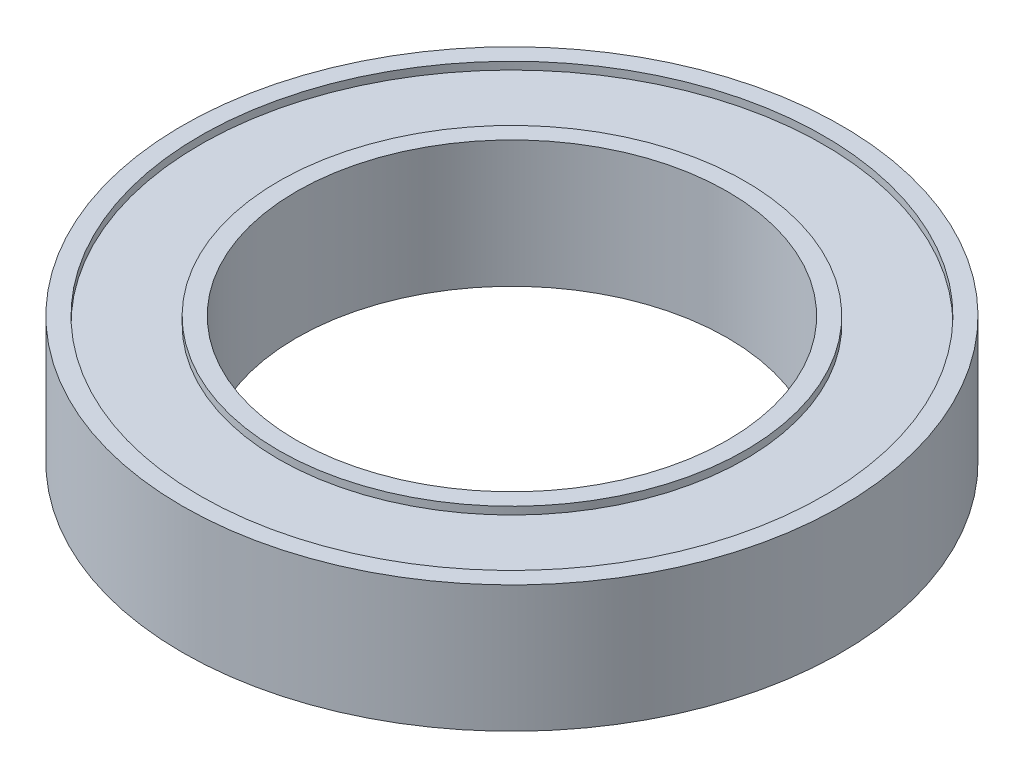
ISO-10303-21;
HEADER;
FILE_DESCRIPTION(('STEP AP214'),'2;1');
FILE_NAME('part.step','',(''),(''),'','','');
FILE_SCHEMA(('AUTOMOTIVE_DESIGN { 1 0 10303 214 1 1 1 1 }'));
ENDSEC;
DATA;
#1=APPLICATION_CONTEXT('core data for automotive mechanical design processes');
#2=APPLICATION_PROTOCOL_DEFINITION('international standard','automotive_design',2000,#1);
#3=PRODUCT_CONTEXT('',#1,'mechanical');
#4=PRODUCT('Part','Part','',(#3));
#5=PRODUCT_RELATED_PRODUCT_CATEGORY('part','',(#4));
#6=PRODUCT_DEFINITION_FORMATION('','',#4);
#7=PRODUCT_DEFINITION_CONTEXT('part definition',#1,'design');
#8=PRODUCT_DEFINITION('design','',#6,#7);
#9=PRODUCT_DEFINITION_SHAPE('','',#8);
#10=(LENGTH_UNIT() NAMED_UNIT(*) SI_UNIT(.MILLI.,.METRE.));
#11=(NAMED_UNIT(*) PLANE_ANGLE_UNIT() SI_UNIT($,.RADIAN.));
#12=(NAMED_UNIT(*) SI_UNIT($,.STERADIAN.) SOLID_ANGLE_UNIT());
#13=UNCERTAINTY_MEASURE_WITH_UNIT(LENGTH_MEASURE(1.E-05),#10,'distance_accuracy_value','');
#14=(GEOMETRIC_REPRESENTATION_CONTEXT(3) GLOBAL_UNCERTAINTY_ASSIGNED_CONTEXT((#13)) GLOBAL_UNIT_ASSIGNED_CONTEXT((#10,
#11,#12)) REPRESENTATION_CONTEXT('',''));
#15=CARTESIAN_POINT('',(0.,0.,0.));
#16=DIRECTION('',(0.,0.,1.));
#17=DIRECTION('',(1.,0.,0.));
#18=AXIS2_PLACEMENT_3D('',#15,#16,#17);
#19=CARTESIAN_POINT('',(0.,0.,0.));
#20=DIRECTION('',(0.,1.,0.));
#21=DIRECTION('',(0.,0.,1.));
#22=AXIS2_PLACEMENT_3D('',#19,#20,#21);
#23=PLANE('',#22);
#24=CARTESIAN_POINT('',(0.,0.,0.));
#25=DIRECTION('',(0.,1.,0.));
#26=DIRECTION('',(0.,0.,1.));
#27=AXIS2_PLACEMENT_3D('',#24,#25,#26);
#28=CIRCLE('',#27,8.5);
#29=CARTESIAN_POINT('',(0.,0.,8.5));
#30=VERTEX_POINT('',#29);
#31=EDGE_CURVE('E58',#30,#30,#28,.T.);
#32=ORIENTED_EDGE('',*,*,#31,.T.);
#33=EDGE_LOOP('',(#32));
#34=FACE_BOUND('',#33,.T.);
#35=CARTESIAN_POINT('',(0.,0.,0.));
#36=DIRECTION('',(0.,1.,0.));
#37=DIRECTION('',(0.,0.,1.));
#38=AXIS2_PLACEMENT_3D('',#35,#36,#37);
#39=CIRCLE('',#38,9.2);
#40=CARTESIAN_POINT('',(0.,0.,9.2));
#41=VERTEX_POINT('',#40);
#42=EDGE_CURVE('E90',#41,#41,#39,.T.);
#43=ORIENTED_EDGE('',*,*,#42,.F.);
#44=EDGE_LOOP('',(#43));
#45=FACE_BOUND('',#44,.T.);
#46=ADVANCED_FACE('F43',(#34,#45),#23,.F.);
#47=CARTESIAN_POINT('',(0.,5.,0.));
#48=DIRECTION('',(0.,1.,0.));
#49=DIRECTION('',(0.,0.,1.));
#50=AXIS2_PLACEMENT_3D('',#47,#48,#49);
#51=PLANE('',#50);
#52=CARTESIAN_POINT('',(0.,5.,0.));
#53=DIRECTION('',(0.,1.,0.));
#54=DIRECTION('',(0.,0.,1.));
#55=AXIS2_PLACEMENT_3D('',#52,#53,#54);
#56=CIRCLE('',#55,8.5);
#57=CARTESIAN_POINT('',(0.,5.,8.5));
#58=VERTEX_POINT('',#57);
#59=EDGE_CURVE('E56',#58,#58,#56,.T.);
#60=ORIENTED_EDGE('',*,*,#59,.F.);
#61=EDGE_LOOP('',(#60));
#62=FACE_BOUND('',#61,.T.);
#63=CARTESIAN_POINT('',(0.,5.,0.));
#64=DIRECTION('',(0.,1.,0.));
#65=DIRECTION('',(0.,0.,1.));
#66=AXIS2_PLACEMENT_3D('',#63,#64,#65);
#67=CIRCLE('',#66,9.2);
#68=CARTESIAN_POINT('',(0.,5.,9.2));
#69=VERTEX_POINT('',#68);
#70=EDGE_CURVE('E74',#69,#69,#67,.T.);
#71=ORIENTED_EDGE('',*,*,#70,.T.);
#72=EDGE_LOOP('',(#71));
#73=FACE_BOUND('',#72,.T.);
#74=ADVANCED_FACE('F108',(#62,#73),#51,.T.);
#75=CARTESIAN_POINT('',(0.,5.,0.));
#76=DIRECTION('',(0.,1.,0.));
#77=DIRECTION('',(0.,0.,1.));
#78=AXIS2_PLACEMENT_3D('',#75,#76,#77);
#79=CIRCLE('',#78,12.3);
#80=CARTESIAN_POINT('',(0.,5.,12.3));
#81=VERTEX_POINT('',#80);
#82=EDGE_CURVE('E66',#81,#81,#79,.T.);
#83=ORIENTED_EDGE('',*,*,#82,.F.);
#84=EDGE_LOOP('',(#83));
#85=FACE_BOUND('',#84,.T.);
#86=CARTESIAN_POINT('',(0.,5.,0.));
#87=DIRECTION('',(0.,1.,0.));
#88=DIRECTION('',(0.,0.,1.));
#89=AXIS2_PLACEMENT_3D('',#86,#87,#88);
#90=CIRCLE('',#89,13.);
#91=CARTESIAN_POINT('',(0.,5.,13.));
#92=VERTEX_POINT('',#91);
#93=EDGE_CURVE('E10',#92,#92,#90,.T.);
#94=ORIENTED_EDGE('',*,*,#93,.T.);
#95=EDGE_LOOP('',(#94));
#96=FACE_BOUND('',#95,.T.);
#97=ADVANCED_FACE('F114',(#85,#96),#51,.T.);
#98=CARTESIAN_POINT('',(0.,0.,0.));
#99=DIRECTION('',(0.,1.,0.));
#100=DIRECTION('',(0.,0.,1.));
#101=AXIS2_PLACEMENT_3D('',#98,#99,#100);
#102=CIRCLE('',#101,12.3);
#103=CARTESIAN_POINT('',(0.,0.,12.3));
#104=VERTEX_POINT('',#103);
#105=EDGE_CURVE('E82',#104,#104,#102,.T.);
#106=ORIENTED_EDGE('',*,*,#105,.T.);
#107=EDGE_LOOP('',(#106));
#108=FACE_BOUND('',#107,.T.);
#109=CARTESIAN_POINT('',(0.,0.,0.));
#110=DIRECTION('',(0.,1.,0.));
#111=DIRECTION('',(0.,0.,1.));
#112=AXIS2_PLACEMENT_3D('',#109,#110,#111);
#113=CIRCLE('',#112,13.);
#114=CARTESIAN_POINT('',(0.,0.,13.));
#115=VERTEX_POINT('',#114);
#116=EDGE_CURVE('E47',#115,#115,#113,.T.);
#117=ORIENTED_EDGE('',*,*,#116,.F.);
#118=EDGE_LOOP('',(#117));
#119=FACE_BOUND('',#118,.T.);
#120=ADVANCED_FACE('F110',(#108,#119),#23,.F.);
#121=CARTESIAN_POINT('',(0.,5.,0.));
#122=DIRECTION('',(0.,-1.,0.));
#123=DIRECTION('',(0.,0.,-1.));
#124=AXIS2_PLACEMENT_3D('',#121,#122,#123);
#125=CYLINDRICAL_SURFACE('',#124,13.);
#126=ORIENTED_EDGE('',*,*,#93,.F.);
#127=EDGE_LOOP('',(#126));
#128=FACE_BOUND('',#127,.T.);
#129=ORIENTED_EDGE('',*,*,#116,.T.);
#130=EDGE_LOOP('',(#129));
#131=FACE_BOUND('',#130,.T.);
#132=ADVANCED_FACE('F45',(#128,#131),#125,.T.);
#133=CARTESIAN_POINT('',(0.,5.,0.));
#134=DIRECTION('',(0.,-1.,0.));
#135=DIRECTION('',(0.,0.,-1.));
#136=AXIS2_PLACEMENT_3D('',#133,#134,#135);
#137=CYLINDRICAL_SURFACE('',#136,8.5);
#138=ORIENTED_EDGE('',*,*,#59,.T.);
#139=EDGE_LOOP('',(#138));
#140=FACE_BOUND('',#139,.T.);
#141=ORIENTED_EDGE('',*,*,#31,.F.);
#142=EDGE_LOOP('',(#141));
#143=FACE_BOUND('',#142,.T.);
#144=ADVANCED_FACE('F123',(#140,#143),#137,.F.);
#145=CARTESIAN_POINT('',(0.,4.7,0.));
#146=DIRECTION('',(0.,1.,0.));
#147=DIRECTION('',(0.,0.,1.));
#148=AXIS2_PLACEMENT_3D('',#145,#146,#147);
#149=CYLINDRICAL_SURFACE('',#148,12.3);
#150=CARTESIAN_POINT('',(0.,4.7,0.));
#151=DIRECTION('',(0.,1.,0.));
#152=DIRECTION('',(0.,0.,1.));
#153=AXIS2_PLACEMENT_3D('',#150,#151,#152);
#154=CIRCLE('',#153,12.3);
#155=CARTESIAN_POINT('',(0.,4.7,12.3));
#156=VERTEX_POINT('',#155);
#157=EDGE_CURVE('E62',#156,#156,#154,.T.);
#158=ORIENTED_EDGE('',*,*,#157,.F.);
#159=EDGE_LOOP('',(#158));
#160=FACE_BOUND('',#159,.T.);
#161=ORIENTED_EDGE('',*,*,#82,.T.);
#162=EDGE_LOOP('',(#161));
#163=FACE_BOUND('',#162,.T.);
#164=ADVANCED_FACE('F147',(#160,#163),#149,.F.);
#165=CARTESIAN_POINT('',(0.,4.7,0.));
#166=DIRECTION('',(0.,1.,0.));
#167=DIRECTION('',(0.,0.,1.));
#168=AXIS2_PLACEMENT_3D('',#165,#166,#167);
#169=PLANE('',#168);
#170=CARTESIAN_POINT('',(0.,4.7,0.));
#171=DIRECTION('',(0.,1.,0.));
#172=DIRECTION('',(0.,0.,1.));
#173=AXIS2_PLACEMENT_3D('',#170,#171,#172);
#174=CIRCLE('',#173,9.2);
#175=CARTESIAN_POINT('',(0.,4.7,9.2));
#176=VERTEX_POINT('',#175);
#177=EDGE_CURVE('E70',#176,#176,#174,.T.);
#178=ORIENTED_EDGE('',*,*,#177,.F.);
#179=EDGE_LOOP('',(#178));
#180=FACE_BOUND('',#179,.T.);
#181=ORIENTED_EDGE('',*,*,#157,.T.);
#182=EDGE_LOOP('',(#181));
#183=FACE_BOUND('',#182,.T.);
#184=ADVANCED_FACE('F143',(#180,#183),#169,.T.);
#185=CARTESIAN_POINT('',(0.,4.7,0.));
#186=DIRECTION('',(0.,1.,0.));
#187=DIRECTION('',(0.,0.,1.));
#188=AXIS2_PLACEMENT_3D('',#185,#186,#187);
#189=CYLINDRICAL_SURFACE('',#188,9.2);
#190=ORIENTED_EDGE('',*,*,#177,.T.);
#191=EDGE_LOOP('',(#190));
#192=FACE_BOUND('',#191,.T.);
#193=ORIENTED_EDGE('',*,*,#70,.F.);
#194=EDGE_LOOP('',(#193));
#195=FACE_BOUND('',#194,.T.);
#196=ADVANCED_FACE('F137',(#192,#195),#189,.T.);
#197=CARTESIAN_POINT('',(0.,0.3,0.));
#198=DIRECTION('',(0.,-1.,0.));
#199=DIRECTION('',(0.,0.,1.));
#200=AXIS2_PLACEMENT_3D('',#197,#198,#199);
#201=PLANE('',#200);
#202=CARTESIAN_POINT('',(0.,0.3,0.));
#203=DIRECTION('',(0.,1.,0.));
#204=DIRECTION('',(0.,0.,1.));
#205=AXIS2_PLACEMENT_3D('',#202,#203,#204);
#206=CIRCLE('',#205,12.3);
#207=CARTESIAN_POINT('',(0.,0.3,12.3));
#208=VERTEX_POINT('',#207);
#209=EDGE_CURVE('E78',#208,#208,#206,.T.);
#210=ORIENTED_EDGE('',*,*,#209,.F.);
#211=EDGE_LOOP('',(#210));
#212=FACE_BOUND('',#211,.T.);
#213=CARTESIAN_POINT('',(0.,0.3,0.));
#214=DIRECTION('',(0.,1.,0.));
#215=DIRECTION('',(0.,0.,1.));
#216=AXIS2_PLACEMENT_3D('',#213,#214,#215);
#217=CIRCLE('',#216,9.2);
#218=CARTESIAN_POINT('',(0.,0.3,9.2));
#219=VERTEX_POINT('',#218);
#220=EDGE_CURVE('E86',#219,#219,#217,.T.);
#221=ORIENTED_EDGE('',*,*,#220,.T.);
#222=EDGE_LOOP('',(#221));
#223=FACE_BOUND('',#222,.T.);
#224=ADVANCED_FACE('F98',(#212,#223),#201,.T.);
#225=CARTESIAN_POINT('',(0.,0.3,0.));
#226=DIRECTION('',(0.,-1.,0.));
#227=DIRECTION('',(0.,0.,-1.));
#228=AXIS2_PLACEMENT_3D('',#225,#226,#227);
#229=CYLINDRICAL_SURFACE('',#228,12.3);
#230=ORIENTED_EDGE('',*,*,#209,.T.);
#231=EDGE_LOOP('',(#230));
#232=FACE_BOUND('',#231,.T.);
#233=ORIENTED_EDGE('',*,*,#105,.F.);
#234=EDGE_LOOP('',(#233));
#235=FACE_BOUND('',#234,.T.);
#236=ADVANCED_FACE('F103',(#232,#235),#229,.F.);
#237=CARTESIAN_POINT('',(0.,0.3,0.));
#238=DIRECTION('',(0.,-1.,0.));
#239=DIRECTION('',(0.,0.,-1.));
#240=AXIS2_PLACEMENT_3D('',#237,#238,#239);
#241=CYLINDRICAL_SURFACE('',#240,9.2);
#242=ORIENTED_EDGE('',*,*,#220,.F.);
#243=EDGE_LOOP('',(#242));
#244=FACE_BOUND('',#243,.T.);
#245=ORIENTED_EDGE('',*,*,#42,.T.);
#246=EDGE_LOOP('',(#245));
#247=FACE_BOUND('',#246,.T.);
#248=ADVANCED_FACE('F100',(#244,#247),#241,.T.);
#249=CLOSED_SHELL('',(#46,#74,#97,#120,#132,#144,#164,#184,#196,#224,#236,#248));
#250=MANIFOLD_SOLID_BREP('B2',#249);
#251=ADVANCED_BREP_SHAPE_REPRESENTATION('',(#18,#250),#14);
#252=SHAPE_DEFINITION_REPRESENTATION(#9,#251);
ENDSEC;
END-ISO-10303-21;
